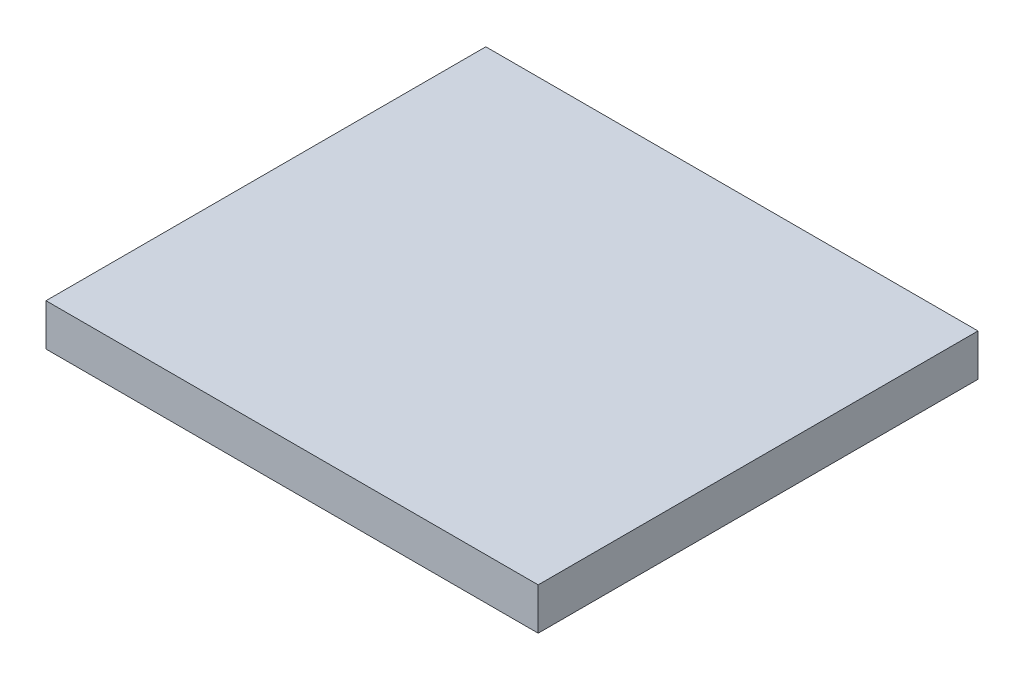
ISO-10303-21;
HEADER;
FILE_DESCRIPTION(('STEP AP214'),'2;1');
FILE_NAME('part.step','',(''),(''),'','','');
FILE_SCHEMA(('AUTOMOTIVE_DESIGN { 1 0 10303 214 1 1 1 1 }'));
ENDSEC;
DATA;
#1=APPLICATION_CONTEXT('core data for automotive mechanical design processes');
#2=APPLICATION_PROTOCOL_DEFINITION('international standard','automotive_design',2000,#1);
#3=PRODUCT_CONTEXT('',#1,'mechanical');
#4=PRODUCT('Part','Part','',(#3));
#5=PRODUCT_RELATED_PRODUCT_CATEGORY('part','',(#4));
#6=PRODUCT_DEFINITION_FORMATION('','',#4);
#7=PRODUCT_DEFINITION_CONTEXT('part definition',#1,'design');
#8=PRODUCT_DEFINITION('design','',#6,#7);
#9=PRODUCT_DEFINITION_SHAPE('','',#8);
#10=(LENGTH_UNIT() NAMED_UNIT(*) SI_UNIT(.MILLI.,.METRE.));
#11=(NAMED_UNIT(*) PLANE_ANGLE_UNIT() SI_UNIT($,.RADIAN.));
#12=(NAMED_UNIT(*) SI_UNIT($,.STERADIAN.) SOLID_ANGLE_UNIT());
#13=UNCERTAINTY_MEASURE_WITH_UNIT(LENGTH_MEASURE(1.E-05),#10,'distance_accuracy_value','');
#14=(GEOMETRIC_REPRESENTATION_CONTEXT(3) GLOBAL_UNCERTAINTY_ASSIGNED_CONTEXT((#13)) GLOBAL_UNIT_ASSIGNED_CONTEXT((#10,
#11,#12)) REPRESENTATION_CONTEXT('',''));
#15=CARTESIAN_POINT('',(0.,0.,0.));
#16=DIRECTION('',(0.,0.,1.));
#17=DIRECTION('',(1.,0.,0.));
#18=AXIS2_PLACEMENT_3D('',#15,#16,#17);
#19=CARTESIAN_POINT('',(0.,-10.,0.));
#20=DIRECTION('',(-1.,0.,0.));
#21=DIRECTION('',(0.,0.,1.));
#22=AXIS2_PLACEMENT_3D('',#19,#20,#21);
#23=PLANE('',#22);
#24=DIRECTION('',(0.,1.,0.));
#25=VECTOR('',#24,1.);
#26=CARTESIAN_POINT('',(0.,-10.,0.));
#27=LINE('',#26,#25);
#28=CARTESIAN_POINT('',(0.,-10.,0.));
#29=VERTEX_POINT('',#28);
#30=CARTESIAN_POINT('',(0.,2.,0.));
#31=VERTEX_POINT('',#30);
#32=EDGE_CURVE('E48',#29,#31,#27,.T.);
#33=ORIENTED_EDGE('',*,*,#32,.T.);
#34=DIRECTION('',(0.,0.,-1.));
#35=VECTOR('',#34,1.);
#36=CARTESIAN_POINT('',(0.,2.,0.));
#37=LINE('',#36,#35);
#38=CARTESIAN_POINT('',(0.,2.,-126.));
#39=VERTEX_POINT('',#38);
#40=EDGE_CURVE('E134',#31,#39,#37,.T.);
#41=ORIENTED_EDGE('',*,*,#40,.T.);
#42=DIRECTION('',(0.,1.,0.));
#43=VECTOR('',#42,1.);
#44=CARTESIAN_POINT('',(0.,-10.,-126.));
#45=LINE('',#44,#43);
#46=CARTESIAN_POINT('',(0.,-10.,-126.));
#47=VERTEX_POINT('',#46);
#48=EDGE_CURVE('E11',#47,#39,#45,.T.);
#49=ORIENTED_EDGE('',*,*,#48,.F.);
#50=DIRECTION('',(0.,0.,1.));
#51=VECTOR('',#50,1.);
#52=CARTESIAN_POINT('',(0.,-10.,0.));
#53=LINE('',#52,#51);
#54=EDGE_CURVE('E177',#47,#29,#53,.T.);
#55=ORIENTED_EDGE('',*,*,#54,.T.);
#56=EDGE_LOOP('',(#33,#41,#49,#55));
#57=FACE_BOUND('',#56,.T.);
#58=ADVANCED_FACE('F45',(#57),#23,.T.);
#59=CARTESIAN_POINT('',(0.,-10.,-126.));
#60=DIRECTION('',(0.,0.,-1.));
#61=DIRECTION('',(-1.,0.,0.));
#62=AXIS2_PLACEMENT_3D('',#59,#60,#61);
#63=PLANE('',#62);
#64=ORIENTED_EDGE('',*,*,#48,.T.);
#65=DIRECTION('',(1.,0.,0.));
#66=VECTOR('',#65,1.);
#67=CARTESIAN_POINT('',(0.,2.,-126.));
#68=LINE('',#67,#66);
#69=CARTESIAN_POINT('',(141.,2.,-126.));
#70=VERTEX_POINT('',#69);
#71=EDGE_CURVE('E131',#39,#70,#68,.T.);
#72=ORIENTED_EDGE('',*,*,#71,.T.);
#73=DIRECTION('',(0.,1.,0.));
#74=VECTOR('',#73,1.);
#75=CARTESIAN_POINT('',(141.,-10.,-126.));
#76=LINE('',#75,#74);
#77=CARTESIAN_POINT('',(141.,-10.,-126.));
#78=VERTEX_POINT('',#77);
#79=EDGE_CURVE('E54',#78,#70,#76,.T.);
#80=ORIENTED_EDGE('',*,*,#79,.F.);
#81=DIRECTION('',(-1.,0.,0.));
#82=VECTOR('',#81,1.);
#83=CARTESIAN_POINT('',(0.,-10.,-126.));
#84=LINE('',#83,#82);
#85=EDGE_CURVE('E195',#78,#47,#84,.T.);
#86=ORIENTED_EDGE('',*,*,#85,.T.);
#87=EDGE_LOOP('',(#64,#72,#80,#86));
#88=FACE_BOUND('',#87,.T.);
#89=ADVANCED_FACE('F205',(#88),#63,.T.);
#90=CARTESIAN_POINT('',(141.,-10.,0.));
#91=DIRECTION('',(1.,0.,0.));
#92=DIRECTION('',(0.,0.,-1.));
#93=AXIS2_PLACEMENT_3D('',#90,#91,#92);
#94=PLANE('',#93);
#95=ORIENTED_EDGE('',*,*,#79,.T.);
#96=DIRECTION('',(0.,0.,-1.));
#97=VECTOR('',#96,1.);
#98=CARTESIAN_POINT('',(141.,2.,0.));
#99=LINE('',#98,#97);
#100=CARTESIAN_POINT('',(141.,2.,0.));
#101=VERTEX_POINT('',#100);
#102=EDGE_CURVE('E125',#101,#70,#99,.T.);
#103=ORIENTED_EDGE('',*,*,#102,.F.);
#104=DIRECTION('',(0.,1.,0.));
#105=VECTOR('',#104,1.);
#106=CARTESIAN_POINT('',(141.,-10.,0.));
#107=LINE('',#106,#105);
#108=CARTESIAN_POINT('',(141.,-10.,0.));
#109=VERTEX_POINT('',#108);
#110=EDGE_CURVE('E112',#109,#101,#107,.T.);
#111=ORIENTED_EDGE('',*,*,#110,.F.);
#112=DIRECTION('',(0.,0.,-1.));
#113=VECTOR('',#112,1.);
#114=CARTESIAN_POINT('',(141.,-10.,0.));
#115=LINE('',#114,#113);
#116=EDGE_CURVE('E192',#109,#78,#115,.T.);
#117=ORIENTED_EDGE('',*,*,#116,.T.);
#118=EDGE_LOOP('',(#95,#103,#111,#117));
#119=FACE_BOUND('',#118,.T.);
#120=ADVANCED_FACE('F126',(#119),#94,.T.);
#121=CARTESIAN_POINT('',(0.,-10.,0.));
#122=DIRECTION('',(0.,0.,1.));
#123=DIRECTION('',(1.,0.,0.));
#124=AXIS2_PLACEMENT_3D('',#121,#122,#123);
#125=PLANE('',#124);
#126=ORIENTED_EDGE('',*,*,#110,.T.);
#127=DIRECTION('',(1.,0.,0.));
#128=VECTOR('',#127,1.);
#129=CARTESIAN_POINT('',(0.,2.,0.));
#130=LINE('',#129,#128);
#131=EDGE_CURVE('E116',#31,#101,#130,.T.);
#132=ORIENTED_EDGE('',*,*,#131,.F.);
#133=ORIENTED_EDGE('',*,*,#32,.F.);
#134=DIRECTION('',(1.,0.,0.));
#135=VECTOR('',#134,1.);
#136=CARTESIAN_POINT('',(0.,-10.,0.));
#137=LINE('',#136,#135);
#138=EDGE_CURVE('E119',#29,#109,#137,.T.);
#139=ORIENTED_EDGE('',*,*,#138,.T.);
#140=EDGE_LOOP('',(#126,#132,#133,#139));
#141=FACE_BOUND('',#140,.T.);
#142=ADVANCED_FACE('F114',(#141),#125,.T.);
#143=CARTESIAN_POINT('',(0.,-10.,0.));
#144=DIRECTION('',(0.,-1.,0.));
#145=DIRECTION('',(0.,0.,-1.));
#146=AXIS2_PLACEMENT_3D('',#143,#144,#145);
#147=PLANE('',#146);
#148=DIRECTION('',(0.,0.,1.));
#149=VECTOR('',#148,1.);
#150=CARTESIAN_POINT('',(5.,-10.,-5.));
#151=LINE('',#150,#149);
#152=CARTESIAN_POINT('',(5.,-10.,-121.));
#153=VERTEX_POINT('',#152);
#154=CARTESIAN_POINT('',(5.,-10.,-5.));
#155=VERTEX_POINT('',#154);
#156=EDGE_CURVE('E143',#153,#155,#151,.T.);
#157=ORIENTED_EDGE('',*,*,#156,.T.);
#158=DIRECTION('',(1.,0.,0.));
#159=VECTOR('',#158,1.);
#160=CARTESIAN_POINT('',(5.,-10.,-5.));
#161=LINE('',#160,#159);
#162=CARTESIAN_POINT('',(136.,-10.,-5.));
#163=VERTEX_POINT('',#162);
#164=EDGE_CURVE('E147',#155,#163,#161,.T.);
#165=ORIENTED_EDGE('',*,*,#164,.T.);
#166=DIRECTION('',(0.,0.,-1.));
#167=VECTOR('',#166,1.);
#168=CARTESIAN_POINT('',(136.,-10.,-5.));
#169=LINE('',#168,#167);
#170=CARTESIAN_POINT('',(136.,-10.,-121.));
#171=VERTEX_POINT('',#170);
#172=EDGE_CURVE('E62',#163,#171,#169,.T.);
#173=ORIENTED_EDGE('',*,*,#172,.T.);
#174=DIRECTION('',(-1.,0.,0.));
#175=VECTOR('',#174,1.);
#176=CARTESIAN_POINT('',(5.,-10.,-121.));
#177=LINE('',#176,#175);
#178=EDGE_CURVE('E154',#171,#153,#177,.T.);
#179=ORIENTED_EDGE('',*,*,#178,.T.);
#180=EDGE_LOOP('',(#157,#165,#173,#179));
#181=FACE_BOUND('',#180,.T.);
#182=ORIENTED_EDGE('',*,*,#54,.F.);
#183=ORIENTED_EDGE('',*,*,#85,.F.);
#184=ORIENTED_EDGE('',*,*,#116,.F.);
#185=ORIENTED_EDGE('',*,*,#138,.F.);
#186=EDGE_LOOP('',(#182,#183,#184,#185));
#187=FACE_BOUND('',#186,.T.);
#188=ADVANCED_FACE('F202',(#181,#187),#147,.T.);
#189=CARTESIAN_POINT('',(5.,-10.,-5.));
#190=DIRECTION('',(-1.,0.,0.));
#191=DIRECTION('',(0.,0.,1.));
#192=AXIS2_PLACEMENT_3D('',#189,#190,#191);
#193=PLANE('',#192);
#194=DIRECTION('',(0.,0.,1.));
#195=VECTOR('',#194,1.);
#196=CARTESIAN_POINT('',(5.,0.,-5.));
#197=LINE('',#196,#195);
#198=CARTESIAN_POINT('',(5.,0.,-121.));
#199=VERTEX_POINT('',#198);
#200=CARTESIAN_POINT('',(5.,0.,-5.));
#201=VERTEX_POINT('',#200);
#202=EDGE_CURVE('E142',#199,#201,#197,.T.);
#203=ORIENTED_EDGE('',*,*,#202,.T.);
#204=DIRECTION('',(0.,1.,0.));
#205=VECTOR('',#204,1.);
#206=CARTESIAN_POINT('',(5.,-10.,-5.));
#207=LINE('',#206,#205);
#208=EDGE_CURVE('E158',#155,#201,#207,.T.);
#209=ORIENTED_EDGE('',*,*,#208,.F.);
#210=ORIENTED_EDGE('',*,*,#156,.F.);
#211=DIRECTION('',(0.,1.,0.));
#212=VECTOR('',#211,1.);
#213=CARTESIAN_POINT('',(5.,-10.,-121.));
#214=LINE('',#213,#212);
#215=EDGE_CURVE('E173',#153,#199,#214,.T.);
#216=ORIENTED_EDGE('',*,*,#215,.T.);
#217=EDGE_LOOP('',(#203,#209,#210,#216));
#218=FACE_BOUND('',#217,.T.);
#219=ADVANCED_FACE('F219',(#218),#193,.F.);
#220=CARTESIAN_POINT('',(5.,-10.,-121.));
#221=DIRECTION('',(0.,0.,-1.));
#222=DIRECTION('',(-1.,0.,0.));
#223=AXIS2_PLACEMENT_3D('',#220,#221,#222);
#224=PLANE('',#223);
#225=DIRECTION('',(-1.,0.,0.));
#226=VECTOR('',#225,1.);
#227=CARTESIAN_POINT('',(5.,0.,-121.));
#228=LINE('',#227,#226);
#229=CARTESIAN_POINT('',(136.,0.,-121.));
#230=VERTEX_POINT('',#229);
#231=EDGE_CURVE('E148',#230,#199,#228,.T.);
#232=ORIENTED_EDGE('',*,*,#231,.T.);
#233=ORIENTED_EDGE('',*,*,#215,.F.);
#234=ORIENTED_EDGE('',*,*,#178,.F.);
#235=DIRECTION('',(0.,1.,0.));
#236=VECTOR('',#235,1.);
#237=CARTESIAN_POINT('',(136.,-10.,-121.));
#238=LINE('',#237,#236);
#239=EDGE_CURVE('E178',#171,#230,#238,.T.);
#240=ORIENTED_EDGE('',*,*,#239,.T.);
#241=EDGE_LOOP('',(#232,#233,#234,#240));
#242=FACE_BOUND('',#241,.T.);
#243=ADVANCED_FACE('F224',(#242),#224,.F.);
#244=CARTESIAN_POINT('',(136.,-10.,-5.));
#245=DIRECTION('',(1.,0.,0.));
#246=DIRECTION('',(0.,0.,-1.));
#247=AXIS2_PLACEMENT_3D('',#244,#245,#246);
#248=PLANE('',#247);
#249=DIRECTION('',(0.,0.,-1.));
#250=VECTOR('',#249,1.);
#251=CARTESIAN_POINT('',(136.,0.,-5.));
#252=LINE('',#251,#250);
#253=CARTESIAN_POINT('',(136.,0.,-5.));
#254=VERTEX_POINT('',#253);
#255=EDGE_CURVE('E166',#254,#230,#252,.T.);
#256=ORIENTED_EDGE('',*,*,#255,.T.);
#257=ORIENTED_EDGE('',*,*,#239,.F.);
#258=ORIENTED_EDGE('',*,*,#172,.F.);
#259=DIRECTION('',(0.,1.,0.));
#260=VECTOR('',#259,1.);
#261=CARTESIAN_POINT('',(136.,-10.,-5.));
#262=LINE('',#261,#260);
#263=EDGE_CURVE('E182',#163,#254,#262,.T.);
#264=ORIENTED_EDGE('',*,*,#263,.T.);
#265=EDGE_LOOP('',(#256,#257,#258,#264));
#266=FACE_BOUND('',#265,.T.);
#267=ADVANCED_FACE('F231',(#266),#248,.F.);
#268=CARTESIAN_POINT('',(5.,-10.,-5.));
#269=DIRECTION('',(0.,0.,1.));
#270=DIRECTION('',(1.,0.,0.));
#271=AXIS2_PLACEMENT_3D('',#268,#269,#270);
#272=PLANE('',#271);
#273=DIRECTION('',(1.,0.,0.));
#274=VECTOR('',#273,1.);
#275=CARTESIAN_POINT('',(5.,0.,-5.));
#276=LINE('',#275,#274);
#277=EDGE_CURVE('E162',#201,#254,#276,.T.);
#278=ORIENTED_EDGE('',*,*,#277,.T.);
#279=ORIENTED_EDGE('',*,*,#263,.F.);
#280=ORIENTED_EDGE('',*,*,#164,.F.);
#281=ORIENTED_EDGE('',*,*,#208,.T.);
#282=EDGE_LOOP('',(#278,#279,#280,#281));
#283=FACE_BOUND('',#282,.T.);
#284=ADVANCED_FACE('F230',(#283),#272,.F.);
#285=CARTESIAN_POINT('',(0.,0.,0.));
#286=DIRECTION('',(0.,1.,0.));
#287=DIRECTION('',(0.,0.,1.));
#288=AXIS2_PLACEMENT_3D('',#285,#286,#287);
#289=PLANE('',#288);
#290=ORIENTED_EDGE('',*,*,#277,.F.);
#291=ORIENTED_EDGE('',*,*,#202,.F.);
#292=ORIENTED_EDGE('',*,*,#231,.F.);
#293=ORIENTED_EDGE('',*,*,#255,.F.);
#294=EDGE_LOOP('',(#290,#291,#292,#293));
#295=FACE_BOUND('',#294,.T.);
#296=ADVANCED_FACE('F233',(#295),#289,.F.);
#297=CARTESIAN_POINT('',(0.,2.,0.));
#298=DIRECTION('',(0.,1.,0.));
#299=DIRECTION('',(0.,0.,1.));
#300=AXIS2_PLACEMENT_3D('',#297,#298,#299);
#301=PLANE('',#300);
#302=ORIENTED_EDGE('',*,*,#131,.T.);
#303=ORIENTED_EDGE('',*,*,#102,.T.);
#304=ORIENTED_EDGE('',*,*,#71,.F.);
#305=ORIENTED_EDGE('',*,*,#40,.F.);
#306=EDGE_LOOP('',(#302,#303,#304,#305));
#307=FACE_BOUND('',#306,.T.);
#308=ADVANCED_FACE('F133',(#307),#301,.T.);
#309=CLOSED_SHELL('',(#58,#89,#120,#142,#188,#219,#243,#267,#284,#296,#308));
#310=MANIFOLD_SOLID_BREP('B2',#309);
#311=ADVANCED_BREP_SHAPE_REPRESENTATION('',(#18,#310),#14);
#312=SHAPE_DEFINITION_REPRESENTATION(#9,#311);
ENDSEC;
END-ISO-10303-21;
